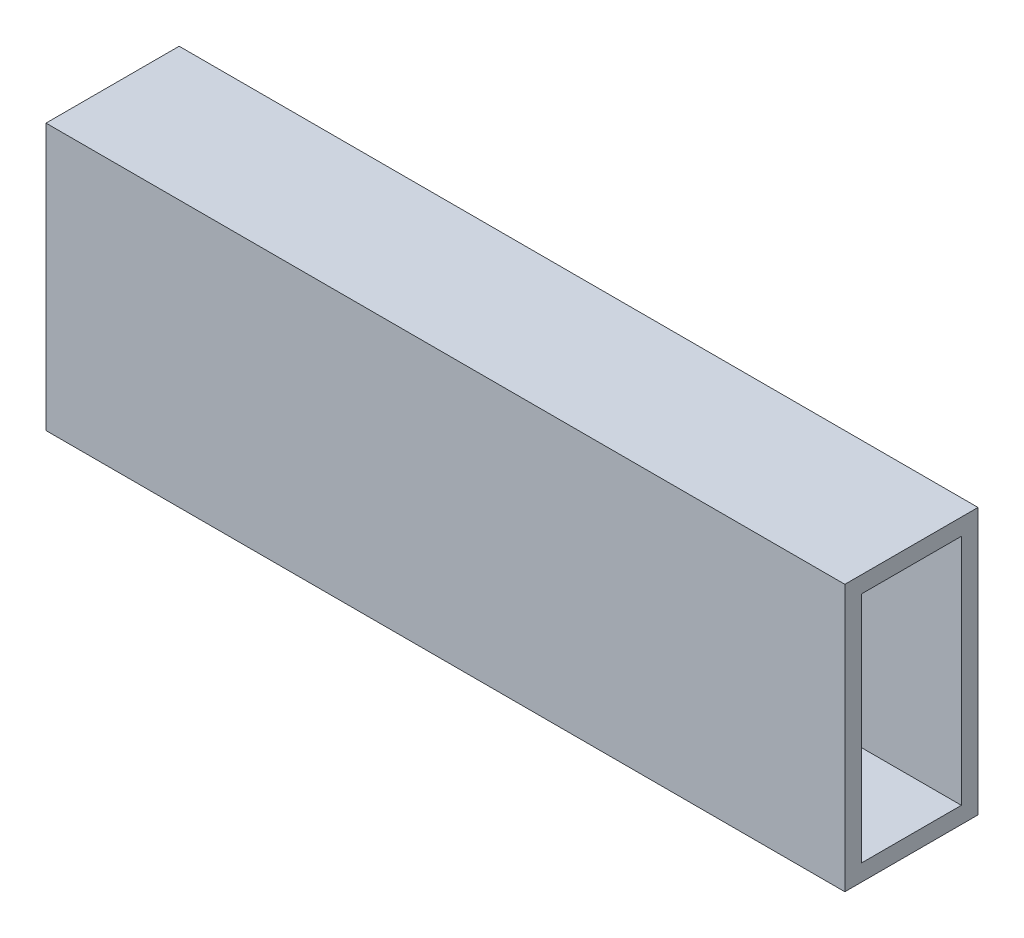
ISO-10303-21;
HEADER;
FILE_DESCRIPTION(('STEP AP214'),'2;1');
FILE_NAME('part.step','',(''),(''),'','','');
FILE_SCHEMA(('AUTOMOTIVE_DESIGN { 1 0 10303 214 1 1 1 1 }'));
ENDSEC;
DATA;
#1=APPLICATION_CONTEXT('core data for automotive mechanical design processes');
#2=APPLICATION_PROTOCOL_DEFINITION('international standard','automotive_design',2000,#1);
#3=PRODUCT_CONTEXT('',#1,'mechanical');
#4=PRODUCT('Part','Part','',(#3));
#5=PRODUCT_RELATED_PRODUCT_CATEGORY('part','',(#4));
#6=PRODUCT_DEFINITION_FORMATION('','',#4);
#7=PRODUCT_DEFINITION_CONTEXT('part definition',#1,'design');
#8=PRODUCT_DEFINITION('design','',#6,#7);
#9=PRODUCT_DEFINITION_SHAPE('','',#8);
#10=(LENGTH_UNIT() NAMED_UNIT(*) SI_UNIT(.MILLI.,.METRE.));
#11=(NAMED_UNIT(*) PLANE_ANGLE_UNIT() SI_UNIT($,.RADIAN.));
#12=(NAMED_UNIT(*) SI_UNIT($,.STERADIAN.) SOLID_ANGLE_UNIT());
#13=UNCERTAINTY_MEASURE_WITH_UNIT(LENGTH_MEASURE(1.E-05),#10,'distance_accuracy_value','');
#14=(GEOMETRIC_REPRESENTATION_CONTEXT(3) GLOBAL_UNCERTAINTY_ASSIGNED_CONTEXT((#13)) GLOBAL_UNIT_ASSIGNED_CONTEXT((#10,
#11,#12)) REPRESENTATION_CONTEXT('',''));
#15=CARTESIAN_POINT('',(0.,0.,0.));
#16=DIRECTION('',(0.,0.,1.));
#17=DIRECTION('',(1.,0.,0.));
#18=AXIS2_PLACEMENT_3D('',#15,#16,#17);
#19=CARTESIAN_POINT('',(76.2,0.,0.));
#20=DIRECTION('',(-1.,0.,0.));
#21=DIRECTION('',(0.,0.,1.));
#22=AXIS2_PLACEMENT_3D('',#19,#20,#21);
#23=PLANE('',#22);
#24=DIRECTION('',(0.,1.,0.));
#25=VECTOR('',#24,1.);
#26=CARTESIAN_POINT('',(76.2,-25.4,-12.7));
#27=LINE('',#26,#25);
#28=CARTESIAN_POINT('',(76.2,-25.4,-12.7));
#29=VERTEX_POINT('',#28);
#30=CARTESIAN_POINT('',(76.2,25.4,-12.7));
#31=VERTEX_POINT('',#30);
#32=EDGE_CURVE('E135',#29,#31,#27,.T.);
#33=ORIENTED_EDGE('',*,*,#32,.T.);
#34=DIRECTION('',(0.,0.,1.));
#35=VECTOR('',#34,1.);
#36=CARTESIAN_POINT('',(76.2,25.4,12.7));
#37=LINE('',#36,#35);
#38=CARTESIAN_POINT('',(76.2,25.4,12.7));
#39=VERTEX_POINT('',#38);
#40=EDGE_CURVE('E138',#31,#39,#37,.T.);
#41=ORIENTED_EDGE('',*,*,#40,.T.);
#42=DIRECTION('',(0.,-1.,0.));
#43=VECTOR('',#42,1.);
#44=CARTESIAN_POINT('',(76.2,-25.4,12.7));
#45=LINE('',#44,#43);
#46=CARTESIAN_POINT('',(76.2,-25.4,12.7));
#47=VERTEX_POINT('',#46);
#48=EDGE_CURVE('E141',#39,#47,#45,.T.);
#49=ORIENTED_EDGE('',*,*,#48,.T.);
#50=DIRECTION('',(0.,0.,-1.));
#51=VECTOR('',#50,1.);
#52=CARTESIAN_POINT('',(76.2,-25.4,12.7));
#53=LINE('',#52,#51);
#54=EDGE_CURVE('E143',#47,#29,#53,.T.);
#55=ORIENTED_EDGE('',*,*,#54,.T.);
#56=EDGE_LOOP('',(#33,#41,#49,#55));
#57=FACE_BOUND('',#56,.T.);
#58=DIRECTION('',(0.,1.,0.));
#59=VECTOR('',#58,1.);
#60=CARTESIAN_POINT('',(76.2,-22.225,-9.52500000000001));
#61=LINE('',#60,#59);
#62=CARTESIAN_POINT('',(76.2,-22.225,-9.52500000000001));
#63=VERTEX_POINT('',#62);
#64=CARTESIAN_POINT('',(76.2,22.225,-9.52500000000001));
#65=VERTEX_POINT('',#64);
#66=EDGE_CURVE('E99',#63,#65,#61,.T.);
#67=ORIENTED_EDGE('',*,*,#66,.F.);
#68=DIRECTION('',(0.,0.,-1.));
#69=VECTOR('',#68,1.);
#70=CARTESIAN_POINT('',(76.2,-22.225,9.525));
#71=LINE('',#70,#69);
#72=CARTESIAN_POINT('',(76.2,-22.225,9.525));
#73=VERTEX_POINT('',#72);
#74=EDGE_CURVE('E121',#73,#63,#71,.T.);
#75=ORIENTED_EDGE('',*,*,#74,.F.);
#76=DIRECTION('',(0.,-1.,0.));
#77=VECTOR('',#76,1.);
#78=CARTESIAN_POINT('',(76.2,-22.225,9.525));
#79=LINE('',#78,#77);
#80=CARTESIAN_POINT('',(76.2,22.225,9.52500000000001));
#81=VERTEX_POINT('',#80);
#82=EDGE_CURVE('E119',#81,#73,#79,.T.);
#83=ORIENTED_EDGE('',*,*,#82,.F.);
#84=DIRECTION('',(0.,0.,1.));
#85=VECTOR('',#84,1.);
#86=CARTESIAN_POINT('',(76.2,22.225,9.52500000000001));
#87=LINE('',#86,#85);
#88=EDGE_CURVE('E107',#65,#81,#87,.T.);
#89=ORIENTED_EDGE('',*,*,#88,.F.);
#90=EDGE_LOOP('',(#67,#75,#83,#89));
#91=FACE_BOUND('',#90,.T.);
#92=ADVANCED_FACE('F34',(#57,#91),#23,.F.);
#93=CARTESIAN_POINT('',(-76.2,0.,0.));
#94=DIRECTION('',(-1.,0.,0.));
#95=DIRECTION('',(0.,0.,1.));
#96=AXIS2_PLACEMENT_3D('',#93,#94,#95);
#97=PLANE('',#96);
#98=DIRECTION('',(0.,1.,0.));
#99=VECTOR('',#98,1.);
#100=CARTESIAN_POINT('',(-76.2,-25.4,-12.7));
#101=LINE('',#100,#99);
#102=CARTESIAN_POINT('',(-76.2,-25.4,-12.7));
#103=VERTEX_POINT('',#102);
#104=CARTESIAN_POINT('',(-76.2,25.4,-12.7));
#105=VERTEX_POINT('',#104);
#106=EDGE_CURVE('E115',#103,#105,#101,.T.);
#107=ORIENTED_EDGE('',*,*,#106,.F.);
#108=DIRECTION('',(0.,0.,-1.));
#109=VECTOR('',#108,1.);
#110=CARTESIAN_POINT('',(-76.2,-25.4,12.7));
#111=LINE('',#110,#109);
#112=CARTESIAN_POINT('',(-76.2,-25.4,12.7));
#113=VERTEX_POINT('',#112);
#114=EDGE_CURVE('E139',#113,#103,#111,.T.);
#115=ORIENTED_EDGE('',*,*,#114,.F.);
#116=DIRECTION('',(0.,-1.,0.));
#117=VECTOR('',#116,1.);
#118=CARTESIAN_POINT('',(-76.2,-25.4,12.7));
#119=LINE('',#118,#117);
#120=CARTESIAN_POINT('',(-76.2,25.4,12.7));
#121=VERTEX_POINT('',#120);
#122=EDGE_CURVE('E150',#121,#113,#119,.T.);
#123=ORIENTED_EDGE('',*,*,#122,.F.);
#124=DIRECTION('',(0.,0.,1.));
#125=VECTOR('',#124,1.);
#126=CARTESIAN_POINT('',(-76.2,25.4,12.7));
#127=LINE('',#126,#125);
#128=EDGE_CURVE('E148',#105,#121,#127,.T.);
#129=ORIENTED_EDGE('',*,*,#128,.F.);
#130=EDGE_LOOP('',(#107,#115,#123,#129));
#131=FACE_BOUND('',#130,.T.);
#132=DIRECTION('',(0.,0.,-1.));
#133=VECTOR('',#132,1.);
#134=CARTESIAN_POINT('',(-76.2,-22.225,9.525));
#135=LINE('',#134,#133);
#136=CARTESIAN_POINT('',(-76.2,-22.225,9.525));
#137=VERTEX_POINT('',#136);
#138=CARTESIAN_POINT('',(-76.2,-22.225,-9.52500000000001));
#139=VERTEX_POINT('',#138);
#140=EDGE_CURVE('E108',#137,#139,#135,.T.);
#141=ORIENTED_EDGE('',*,*,#140,.T.);
#142=DIRECTION('',(0.,1.,0.));
#143=VECTOR('',#142,1.);
#144=CARTESIAN_POINT('',(-76.2,-22.225,-9.52500000000001));
#145=LINE('',#144,#143);
#146=CARTESIAN_POINT('',(-76.2,22.225,-9.52500000000001));
#147=VERTEX_POINT('',#146);
#148=EDGE_CURVE('E57',#139,#147,#145,.T.);
#149=ORIENTED_EDGE('',*,*,#148,.T.);
#150=DIRECTION('',(0.,0.,1.));
#151=VECTOR('',#150,1.);
#152=CARTESIAN_POINT('',(-76.2,22.225,9.52500000000001));
#153=LINE('',#152,#151);
#154=CARTESIAN_POINT('',(-76.2,22.225,9.52500000000001));
#155=VERTEX_POINT('',#154);
#156=EDGE_CURVE('E114',#147,#155,#153,.T.);
#157=ORIENTED_EDGE('',*,*,#156,.T.);
#158=DIRECTION('',(0.,-1.,0.));
#159=VECTOR('',#158,1.);
#160=CARTESIAN_POINT('',(-76.2,-22.225,9.525));
#161=LINE('',#160,#159);
#162=EDGE_CURVE('E127',#155,#137,#161,.T.);
#163=ORIENTED_EDGE('',*,*,#162,.T.);
#164=EDGE_LOOP('',(#141,#149,#157,#163));
#165=FACE_BOUND('',#164,.T.);
#166=ADVANCED_FACE('F168',(#131,#165),#97,.T.);
#167=CARTESIAN_POINT('',(76.2,-25.4,-12.7));
#168=DIRECTION('',(0.,0.,1.));
#169=DIRECTION('',(1.,0.,0.));
#170=AXIS2_PLACEMENT_3D('',#167,#168,#169);
#171=PLANE('',#170);
#172=ORIENTED_EDGE('',*,*,#106,.T.);
#173=DIRECTION('',(-1.,0.,0.));
#174=VECTOR('',#173,1.);
#175=CARTESIAN_POINT('',(76.2,25.4,-12.7));
#176=LINE('',#175,#174);
#177=EDGE_CURVE('E11',#31,#105,#176,.T.);
#178=ORIENTED_EDGE('',*,*,#177,.F.);
#179=ORIENTED_EDGE('',*,*,#32,.F.);
#180=DIRECTION('',(-1.,0.,0.));
#181=VECTOR('',#180,1.);
#182=CARTESIAN_POINT('',(76.2,-25.4,-12.7));
#183=LINE('',#182,#181);
#184=EDGE_CURVE('E145',#29,#103,#183,.T.);
#185=ORIENTED_EDGE('',*,*,#184,.T.);
#186=EDGE_LOOP('',(#172,#178,#179,#185));
#187=FACE_BOUND('',#186,.T.);
#188=ADVANCED_FACE('F36',(#187),#171,.F.);
#189=CARTESIAN_POINT('',(76.2,25.4,12.7));
#190=DIRECTION('',(0.,-1.,0.));
#191=DIRECTION('',(0.,0.,-1.));
#192=AXIS2_PLACEMENT_3D('',#189,#190,#191);
#193=PLANE('',#192);
#194=ORIENTED_EDGE('',*,*,#128,.T.);
#195=DIRECTION('',(-1.,0.,0.));
#196=VECTOR('',#195,1.);
#197=CARTESIAN_POINT('',(76.2,25.4,12.7));
#198=LINE('',#197,#196);
#199=EDGE_CURVE('E42',#39,#121,#198,.T.);
#200=ORIENTED_EDGE('',*,*,#199,.F.);
#201=ORIENTED_EDGE('',*,*,#40,.F.);
#202=ORIENTED_EDGE('',*,*,#177,.T.);
#203=EDGE_LOOP('',(#194,#200,#201,#202));
#204=FACE_BOUND('',#203,.T.);
#205=ADVANCED_FACE('F178',(#204),#193,.F.);
#206=CARTESIAN_POINT('',(76.2,-25.4,12.7));
#207=DIRECTION('',(0.,0.,-1.));
#208=DIRECTION('',(0.,1.,0.));
#209=AXIS2_PLACEMENT_3D('',#206,#207,#208);
#210=PLANE('',#209);
#211=ORIENTED_EDGE('',*,*,#122,.T.);
#212=DIRECTION('',(-1.,0.,0.));
#213=VECTOR('',#212,1.);
#214=CARTESIAN_POINT('',(76.2,-25.4,12.7));
#215=LINE('',#214,#213);
#216=EDGE_CURVE('E155',#47,#113,#215,.T.);
#217=ORIENTED_EDGE('',*,*,#216,.F.);
#218=ORIENTED_EDGE('',*,*,#48,.F.);
#219=ORIENTED_EDGE('',*,*,#199,.T.);
#220=EDGE_LOOP('',(#211,#217,#218,#219));
#221=FACE_BOUND('',#220,.T.);
#222=ADVANCED_FACE('F162',(#221),#210,.F.);
#223=CARTESIAN_POINT('',(76.2,-25.4,12.7));
#224=DIRECTION('',(0.,1.,0.));
#225=DIRECTION('',(0.,0.,1.));
#226=AXIS2_PLACEMENT_3D('',#223,#224,#225);
#227=PLANE('',#226);
#228=ORIENTED_EDGE('',*,*,#114,.T.);
#229=ORIENTED_EDGE('',*,*,#184,.F.);
#230=ORIENTED_EDGE('',*,*,#54,.F.);
#231=ORIENTED_EDGE('',*,*,#216,.T.);
#232=EDGE_LOOP('',(#228,#229,#230,#231));
#233=FACE_BOUND('',#232,.T.);
#234=ADVANCED_FACE('F172',(#233),#227,.F.);
#235=CARTESIAN_POINT('',(76.2,-22.225,-9.52500000000001));
#236=DIRECTION('',(0.,0.,1.));
#237=DIRECTION('',(1.,0.,0.));
#238=AXIS2_PLACEMENT_3D('',#235,#236,#237);
#239=PLANE('',#238);
#240=ORIENTED_EDGE('',*,*,#148,.F.);
#241=DIRECTION('',(-1.,0.,0.));
#242=VECTOR('',#241,1.);
#243=CARTESIAN_POINT('',(76.2,-22.225,-9.52500000000001));
#244=LINE('',#243,#242);
#245=EDGE_CURVE('E103',#63,#139,#244,.T.);
#246=ORIENTED_EDGE('',*,*,#245,.F.);
#247=ORIENTED_EDGE('',*,*,#66,.T.);
#248=DIRECTION('',(-1.,0.,0.));
#249=VECTOR('',#248,1.);
#250=CARTESIAN_POINT('',(76.2,22.225,-9.52500000000001));
#251=LINE('',#250,#249);
#252=EDGE_CURVE('E102',#65,#147,#251,.T.);
#253=ORIENTED_EDGE('',*,*,#252,.T.);
#254=EDGE_LOOP('',(#240,#246,#247,#253));
#255=FACE_BOUND('',#254,.T.);
#256=ADVANCED_FACE('F101',(#255),#239,.T.);
#257=CARTESIAN_POINT('',(76.2,22.225,9.52500000000001));
#258=DIRECTION('',(0.,-1.,0.));
#259=DIRECTION('',(0.,0.,-1.));
#260=AXIS2_PLACEMENT_3D('',#257,#258,#259);
#261=PLANE('',#260);
#262=ORIENTED_EDGE('',*,*,#156,.F.);
#263=ORIENTED_EDGE('',*,*,#252,.F.);
#264=ORIENTED_EDGE('',*,*,#88,.T.);
#265=DIRECTION('',(-1.,0.,0.));
#266=VECTOR('',#265,1.);
#267=CARTESIAN_POINT('',(76.2,22.225,9.52500000000001));
#268=LINE('',#267,#266);
#269=EDGE_CURVE('E116',#81,#155,#268,.T.);
#270=ORIENTED_EDGE('',*,*,#269,.T.);
#271=EDGE_LOOP('',(#262,#263,#264,#270));
#272=FACE_BOUND('',#271,.T.);
#273=ADVANCED_FACE('F111',(#272),#261,.T.);
#274=CARTESIAN_POINT('',(76.2,-22.225,9.525));
#275=DIRECTION('',(0.,0.,-1.));
#276=DIRECTION('',(0.,1.,0.));
#277=AXIS2_PLACEMENT_3D('',#274,#275,#276);
#278=PLANE('',#277);
#279=ORIENTED_EDGE('',*,*,#162,.F.);
#280=ORIENTED_EDGE('',*,*,#269,.F.);
#281=ORIENTED_EDGE('',*,*,#82,.T.);
#282=DIRECTION('',(-1.,0.,0.));
#283=VECTOR('',#282,1.);
#284=CARTESIAN_POINT('',(76.2,-22.225,9.525));
#285=LINE('',#284,#283);
#286=EDGE_CURVE('E49',#73,#137,#285,.T.);
#287=ORIENTED_EDGE('',*,*,#286,.T.);
#288=EDGE_LOOP('',(#279,#280,#281,#287));
#289=FACE_BOUND('',#288,.T.);
#290=ADVANCED_FACE('F201',(#289),#278,.T.);
#291=CARTESIAN_POINT('',(76.2,-22.225,9.525));
#292=DIRECTION('',(0.,1.,0.));
#293=DIRECTION('',(0.,0.,1.));
#294=AXIS2_PLACEMENT_3D('',#291,#292,#293);
#295=PLANE('',#294);
#296=ORIENTED_EDGE('',*,*,#140,.F.);
#297=ORIENTED_EDGE('',*,*,#286,.F.);
#298=ORIENTED_EDGE('',*,*,#74,.T.);
#299=ORIENTED_EDGE('',*,*,#245,.T.);
#300=EDGE_LOOP('',(#296,#297,#298,#299));
#301=FACE_BOUND('',#300,.T.);
#302=ADVANCED_FACE('F205',(#301),#295,.T.);
#303=CLOSED_SHELL('',(#92,#166,#188,#205,#222,#234,#256,#273,#290,#302));
#304=MANIFOLD_SOLID_BREP('B2',#303);
#305=ADVANCED_BREP_SHAPE_REPRESENTATION('',(#18,#304),#14);
#306=SHAPE_DEFINITION_REPRESENTATION(#9,#305);
ENDSEC;
END-ISO-10303-21;
